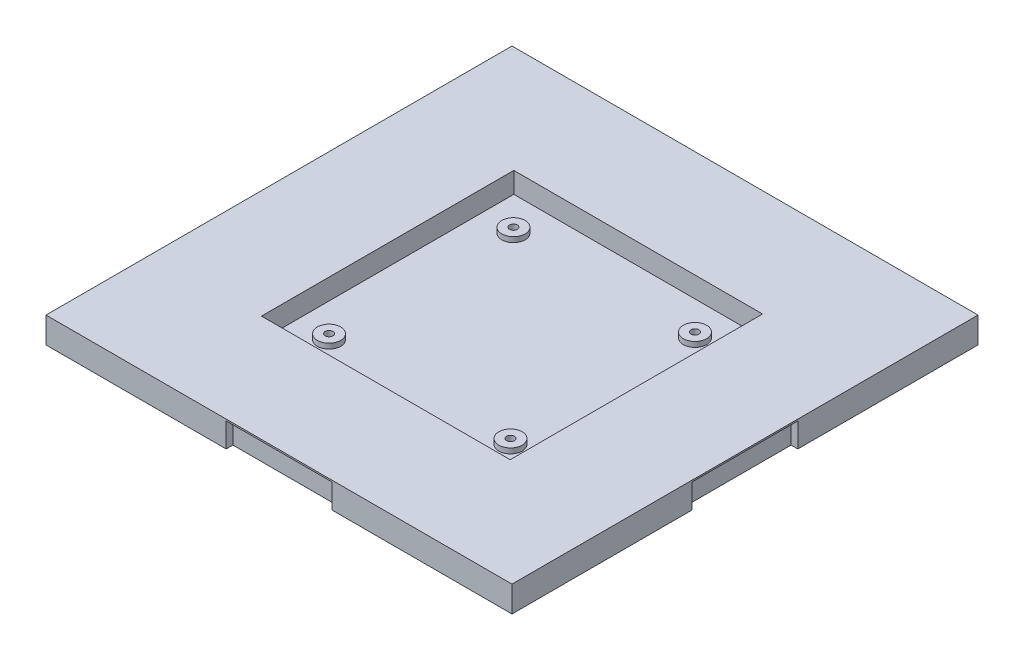
ISO-10303-21;
HEADER;
FILE_DESCRIPTION(('STEP AP214'),'2;1');
FILE_NAME('part.step','',(''),(''),'','','');
FILE_SCHEMA(('AUTOMOTIVE_DESIGN { 1 0 10303 214 1 1 1 1 }'));
ENDSEC;
DATA;
#1=APPLICATION_CONTEXT('core data for automotive mechanical design processes');
#2=APPLICATION_PROTOCOL_DEFINITION('international standard','automotive_design',2000,#1);
#3=PRODUCT_CONTEXT('',#1,'mechanical');
#4=PRODUCT('Part','Part','',(#3));
#5=PRODUCT_RELATED_PRODUCT_CATEGORY('part','',(#4));
#6=PRODUCT_DEFINITION_FORMATION('','',#4);
#7=PRODUCT_DEFINITION_CONTEXT('part definition',#1,'design');
#8=PRODUCT_DEFINITION('design','',#6,#7);
#9=PRODUCT_DEFINITION_SHAPE('','',#8);
#10=(LENGTH_UNIT() NAMED_UNIT(*) SI_UNIT(.MILLI.,.METRE.));
#11=(NAMED_UNIT(*) PLANE_ANGLE_UNIT() SI_UNIT($,.RADIAN.));
#12=(NAMED_UNIT(*) SI_UNIT($,.STERADIAN.) SOLID_ANGLE_UNIT());
#13=UNCERTAINTY_MEASURE_WITH_UNIT(LENGTH_MEASURE(1.E-05),#10,'distance_accuracy_value','');
#14=(GEOMETRIC_REPRESENTATION_CONTEXT(3) GLOBAL_UNCERTAINTY_ASSIGNED_CONTEXT((#13)) GLOBAL_UNIT_ASSIGNED_CONTEXT((#10,
#11,#12)) REPRESENTATION_CONTEXT('',''));
#15=CARTESIAN_POINT('',(0.,0.,0.));
#16=DIRECTION('',(0.,0.,1.));
#17=DIRECTION('',(1.,0.,0.));
#18=AXIS2_PLACEMENT_3D('',#15,#16,#17);
#19=CARTESIAN_POINT('',(0.,10.,48.73501539));
#20=DIRECTION('',(0.,0.,1.));
#21=DIRECTION('',(1.,0.,0.));
#22=AXIS2_PLACEMENT_3D('',#19,#20,#21);
#23=PLANE('',#22);
#24=DIRECTION('',(0.,-1.,0.));
#25=VECTOR('',#24,1.);
#26=CARTESIAN_POINT('',(48.0365109443665,10.,48.73501539));
#27=LINE('',#26,#25);
#28=CARTESIAN_POINT('',(48.0365109443665,10.,48.73501539));
#29=VERTEX_POINT('',#28);
#30=CARTESIAN_POINT('',(48.0365109443665,2.,48.73501539));
#31=VERTEX_POINT('',#30);
#32=EDGE_CURVE('E476',#29,#31,#27,.T.);
#33=ORIENTED_EDGE('',*,*,#32,.T.);
#34=DIRECTION('',(-1.,0.,0.));
#35=VECTOR('',#34,1.);
#36=CARTESIAN_POINT('',(0.,2.,48.73501539));
#37=LINE('',#36,#35);
#38=CARTESIAN_POINT('',(-48.0365109443665,2.,48.73501539));
#39=VERTEX_POINT('',#38);
#40=EDGE_CURVE('E417',#31,#39,#37,.T.);
#41=ORIENTED_EDGE('',*,*,#40,.T.);
#42=DIRECTION('',(0.,-1.,0.));
#43=VECTOR('',#42,1.);
#44=CARTESIAN_POINT('',(-48.0365109443665,10.,48.73501539));
#45=LINE('',#44,#43);
#46=CARTESIAN_POINT('',(-48.0365109443665,10.,48.73501539));
#47=VERTEX_POINT('',#46);
#48=EDGE_CURVE('E489',#47,#39,#45,.T.);
#49=ORIENTED_EDGE('',*,*,#48,.F.);
#50=DIRECTION('',(-1.,0.,0.));
#51=VECTOR('',#50,1.);
#52=CARTESIAN_POINT('',(0.,10.,48.73501539));
#53=LINE('',#52,#51);
#54=EDGE_CURVE('E445',#29,#47,#53,.T.);
#55=ORIENTED_EDGE('',*,*,#54,.F.);
#56=EDGE_LOOP('',(#33,#41,#49,#55));
#57=FACE_BOUND('',#56,.T.);
#58=ADVANCED_FACE('F40',(#57),#23,.F.);
#59=CARTESIAN_POINT('',(-48.0365109443665,10.,0.));
#60=DIRECTION('',(-1.,0.,0.));
#61=DIRECTION('',(0.,0.,1.));
#62=AXIS2_PLACEMENT_3D('',#59,#60,#61);
#63=PLANE('',#62);
#64=ORIENTED_EDGE('',*,*,#48,.T.);
#65=DIRECTION('',(0.,0.,-1.));
#66=VECTOR('',#65,1.);
#67=CARTESIAN_POINT('',(-48.0365109443665,2.,0.));
#68=LINE('',#67,#66);
#69=CARTESIAN_POINT('',(-48.0365109443665,2.,-48.73501539));
#70=VERTEX_POINT('',#69);
#71=EDGE_CURVE('E413',#39,#70,#68,.T.);
#72=ORIENTED_EDGE('',*,*,#71,.T.);
#73=DIRECTION('',(0.,-1.,0.));
#74=VECTOR('',#73,1.);
#75=CARTESIAN_POINT('',(-48.0365109443665,10.,-48.73501539));
#76=LINE('',#75,#74);
#77=CARTESIAN_POINT('',(-48.0365109443665,10.,-48.73501539));
#78=VERTEX_POINT('',#77);
#79=EDGE_CURVE('E485',#78,#70,#76,.T.);
#80=ORIENTED_EDGE('',*,*,#79,.F.);
#81=DIRECTION('',(0.,0.,-1.));
#82=VECTOR('',#81,1.);
#83=CARTESIAN_POINT('',(-48.0365109443665,10.,0.));
#84=LINE('',#83,#82);
#85=EDGE_CURVE('E449',#47,#78,#84,.T.);
#86=ORIENTED_EDGE('',*,*,#85,.F.);
#87=EDGE_LOOP('',(#64,#72,#80,#86));
#88=FACE_BOUND('',#87,.T.);
#89=ADVANCED_FACE('F586',(#88),#63,.F.);
#90=CARTESIAN_POINT('',(0.,10.,-48.73501539));
#91=DIRECTION('',(0.,0.,-1.));
#92=DIRECTION('',(-1.,0.,0.));
#93=AXIS2_PLACEMENT_3D('',#90,#91,#92);
#94=PLANE('',#93);
#95=ORIENTED_EDGE('',*,*,#79,.T.);
#96=DIRECTION('',(1.,0.,0.));
#97=VECTOR('',#96,1.);
#98=CARTESIAN_POINT('',(0.,2.,-48.73501539));
#99=LINE('',#98,#97);
#100=CARTESIAN_POINT('',(48.0365109443665,2.,-48.73501539));
#101=VERTEX_POINT('',#100);
#102=EDGE_CURVE('E425',#70,#101,#99,.T.);
#103=ORIENTED_EDGE('',*,*,#102,.T.);
#104=DIRECTION('',(0.,-1.,0.));
#105=VECTOR('',#104,1.);
#106=CARTESIAN_POINT('',(48.0365109443665,10.,-48.73501539));
#107=LINE('',#106,#105);
#108=CARTESIAN_POINT('',(48.0365109443665,10.,-48.73501539));
#109=VERTEX_POINT('',#108);
#110=EDGE_CURVE('E480',#109,#101,#107,.T.);
#111=ORIENTED_EDGE('',*,*,#110,.F.);
#112=DIRECTION('',(1.,0.,0.));
#113=VECTOR('',#112,1.);
#114=CARTESIAN_POINT('',(0.,10.,-48.73501539));
#115=LINE('',#114,#113);
#116=EDGE_CURVE('E452',#78,#109,#115,.T.);
#117=ORIENTED_EDGE('',*,*,#116,.F.);
#118=EDGE_LOOP('',(#95,#103,#111,#117));
#119=FACE_BOUND('',#118,.T.);
#120=ADVANCED_FACE('F592',(#119),#94,.F.);
#121=CARTESIAN_POINT('',(90.,10.,0.));
#122=DIRECTION('',(1.,0.,0.));
#123=DIRECTION('',(0.,0.,-1.));
#124=AXIS2_PLACEMENT_3D('',#121,#122,#123);
#125=PLANE('',#124);
#126=DIRECTION('',(0.,-1.,0.));
#127=VECTOR('',#126,1.);
#128=CARTESIAN_POINT('',(90.,10.,20.40004931462));
#129=LINE('',#128,#127);
#130=CARTESIAN_POINT('',(90.,9.40000000000001,20.40004931462));
#131=VERTEX_POINT('',#130);
#132=CARTESIAN_POINT('',(90.,0.,20.40004931462));
#133=VERTEX_POINT('',#132);
#134=EDGE_CURVE('E294',#131,#133,#129,.T.);
#135=ORIENTED_EDGE('',*,*,#134,.F.);
#136=DIRECTION('',(0.,0.,-1.));
#137=VECTOR('',#136,1.);
#138=CARTESIAN_POINT('',(90.,9.40000000000001,0.));
#139=LINE('',#138,#137);
#140=CARTESIAN_POINT('',(90.,9.40000000000001,-20.39995068538));
#141=VERTEX_POINT('',#140);
#142=EDGE_CURVE('E11',#131,#141,#139,.T.);
#143=ORIENTED_EDGE('',*,*,#142,.T.);
#144=DIRECTION('',(0.,-1.,0.));
#145=VECTOR('',#144,1.);
#146=CARTESIAN_POINT('',(90.,10.,-20.39995068538));
#147=LINE('',#146,#145);
#148=CARTESIAN_POINT('',(90.,0.,-20.39995068538));
#149=VERTEX_POINT('',#148);
#150=EDGE_CURVE('E290',#141,#149,#147,.T.);
#151=ORIENTED_EDGE('',*,*,#150,.T.);
#152=DIRECTION('',(0.,0.,1.));
#153=VECTOR('',#152,1.);
#154=CARTESIAN_POINT('',(90.,0.,0.));
#155=LINE('',#154,#153);
#156=CARTESIAN_POINT('',(90.,0.,-90.));
#157=VERTEX_POINT('',#156);
#158=EDGE_CURVE('E459',#157,#149,#155,.T.);
#159=ORIENTED_EDGE('',*,*,#158,.F.);
#160=DIRECTION('',(0.,-1.,0.));
#161=VECTOR('',#160,1.);
#162=CARTESIAN_POINT('',(90.,10.,-90.));
#163=LINE('',#162,#161);
#164=CARTESIAN_POINT('',(90.,10.,-90.));
#165=VERTEX_POINT('',#164);
#166=EDGE_CURVE('E481',#165,#157,#163,.T.);
#167=ORIENTED_EDGE('',*,*,#166,.F.);
#168=DIRECTION('',(0.,0.,1.));
#169=VECTOR('',#168,1.);
#170=CARTESIAN_POINT('',(90.,10.,0.));
#171=LINE('',#170,#169);
#172=CARTESIAN_POINT('',(90.,10.,90.));
#173=VERTEX_POINT('',#172);
#174=EDGE_CURVE('E430',#165,#173,#171,.T.);
#175=ORIENTED_EDGE('',*,*,#174,.T.);
#176=DIRECTION('',(0.,-1.,0.));
#177=VECTOR('',#176,1.);
#178=CARTESIAN_POINT('',(90.,10.,90.));
#179=LINE('',#178,#177);
#180=CARTESIAN_POINT('',(90.,0.,90.));
#181=VERTEX_POINT('',#180);
#182=EDGE_CURVE('E458',#173,#181,#179,.T.);
#183=ORIENTED_EDGE('',*,*,#182,.T.);
#184=EDGE_CURVE('E429',#133,#181,#155,.T.);
#185=ORIENTED_EDGE('',*,*,#184,.F.);
#186=EDGE_LOOP('',(#135,#143,#151,#159,#167,#175,#183,#185));
#187=FACE_BOUND('',#186,.T.);
#188=ADVANCED_FACE('F42',(#187),#125,.T.);
#189=CARTESIAN_POINT('',(0.,10.,-90.));
#190=DIRECTION('',(0.,0.,-1.));
#191=DIRECTION('',(-1.,0.,0.));
#192=AXIS2_PLACEMENT_3D('',#189,#190,#191);
#193=PLANE('',#192);
#194=DIRECTION('',(0.,-1.,0.));
#195=VECTOR('',#194,1.);
#196=CARTESIAN_POINT('',(20.4,0.,-90.));
#197=LINE('',#196,#195);
#198=CARTESIAN_POINT('',(20.4,9.40000000000001,-90.));
#199=VERTEX_POINT('',#198);
#200=CARTESIAN_POINT('',(20.4,0.,-90.));
#201=VERTEX_POINT('',#200);
#202=EDGE_CURVE('E318',#199,#201,#197,.T.);
#203=ORIENTED_EDGE('',*,*,#202,.F.);
#204=DIRECTION('',(-1.,0.,0.));
#205=VECTOR('',#204,1.);
#206=CARTESIAN_POINT('',(0.,9.40000000000001,-90.));
#207=LINE('',#206,#205);
#208=CARTESIAN_POINT('',(-20.4,9.40000000000001,-90.));
#209=VERTEX_POINT('',#208);
#210=EDGE_CURVE('E331',#199,#209,#207,.T.);
#211=ORIENTED_EDGE('',*,*,#210,.T.);
#212=DIRECTION('',(0.,-1.,0.));
#213=VECTOR('',#212,1.);
#214=CARTESIAN_POINT('',(-20.4,0.,-90.));
#215=LINE('',#214,#213);
#216=CARTESIAN_POINT('',(-20.4,0.,-90.));
#217=VERTEX_POINT('',#216);
#218=EDGE_CURVE('E312',#209,#217,#215,.T.);
#219=ORIENTED_EDGE('',*,*,#218,.T.);
#220=DIRECTION('',(1.,0.,0.));
#221=VECTOR('',#220,1.);
#222=CARTESIAN_POINT('',(0.,0.,-90.));
#223=LINE('',#222,#221);
#224=CARTESIAN_POINT('',(-90.,0.,-90.));
#225=VERTEX_POINT('',#224);
#226=EDGE_CURVE('E464',#225,#217,#223,.T.);
#227=ORIENTED_EDGE('',*,*,#226,.F.);
#228=DIRECTION('',(0.,-1.,0.));
#229=VECTOR('',#228,1.);
#230=CARTESIAN_POINT('',(-90.,10.,-90.));
#231=LINE('',#230,#229);
#232=CARTESIAN_POINT('',(-90.,10.,-90.));
#233=VERTEX_POINT('',#232);
#234=EDGE_CURVE('E501',#233,#225,#231,.T.);
#235=ORIENTED_EDGE('',*,*,#234,.F.);
#236=DIRECTION('',(1.,0.,0.));
#237=VECTOR('',#236,1.);
#238=CARTESIAN_POINT('',(0.,10.,-90.));
#239=LINE('',#238,#237);
#240=EDGE_CURVE('E434',#233,#165,#239,.T.);
#241=ORIENTED_EDGE('',*,*,#240,.T.);
#242=ORIENTED_EDGE('',*,*,#166,.T.);
#243=EDGE_CURVE('E463',#201,#157,#223,.T.);
#244=ORIENTED_EDGE('',*,*,#243,.F.);
#245=EDGE_LOOP('',(#203,#211,#219,#227,#235,#241,#242,#244));
#246=FACE_BOUND('',#245,.T.);
#247=ADVANCED_FACE('F524',(#246),#193,.T.);
#248=CARTESIAN_POINT('',(-90.,10.,0.));
#249=DIRECTION('',(1.,0.,0.));
#250=DIRECTION('',(0.,0.,-1.));
#251=AXIS2_PLACEMENT_3D('',#248,#249,#250);
#252=PLANE('',#251);
#253=DIRECTION('',(0.,0.,1.));
#254=VECTOR('',#253,1.);
#255=CARTESIAN_POINT('',(-90.,0.,0.));
#256=LINE('',#255,#254);
#257=CARTESIAN_POINT('',(-90.,0.,-20.3964704723527));
#258=VERTEX_POINT('',#257);
#259=EDGE_CURVE('E468',#225,#258,#256,.T.);
#260=ORIENTED_EDGE('',*,*,#259,.T.);
#261=DIRECTION('',(0.,1.,0.));
#262=VECTOR('',#261,1.);
#263=CARTESIAN_POINT('',(-90.,10.,-20.3964704723527));
#264=LINE('',#263,#262);
#265=CARTESIAN_POINT('',(-90.,9.40000000000001,-20.3964704723527));
#266=VERTEX_POINT('',#265);
#267=EDGE_CURVE('E308',#258,#266,#264,.T.);
#268=ORIENTED_EDGE('',*,*,#267,.T.);
#269=DIRECTION('',(0.,0.,-1.));
#270=VECTOR('',#269,1.);
#271=CARTESIAN_POINT('',(-90.,9.40000000000001,0.));
#272=LINE('',#271,#270);
#273=CARTESIAN_POINT('',(-90.,9.40000000000001,20.4035295276473));
#274=VERTEX_POINT('',#273);
#275=EDGE_CURVE('E49',#274,#266,#272,.T.);
#276=ORIENTED_EDGE('',*,*,#275,.F.);
#277=DIRECTION('',(0.,1.,0.));
#278=VECTOR('',#277,1.);
#279=CARTESIAN_POINT('',(-90.,10.,20.4035295276473));
#280=LINE('',#279,#278);
#281=CARTESIAN_POINT('',(-90.,0.,20.4035295276473));
#282=VERTEX_POINT('',#281);
#283=EDGE_CURVE('E305',#282,#274,#280,.T.);
#284=ORIENTED_EDGE('',*,*,#283,.F.);
#285=CARTESIAN_POINT('',(-90.,0.,90.));
#286=VERTEX_POINT('',#285);
#287=EDGE_CURVE('E227',#282,#286,#256,.T.);
#288=ORIENTED_EDGE('',*,*,#287,.T.);
#289=DIRECTION('',(0.,-1.,0.));
#290=VECTOR('',#289,1.);
#291=CARTESIAN_POINT('',(-90.,10.,90.));
#292=LINE('',#291,#290);
#293=CARTESIAN_POINT('',(-90.,10.,90.));
#294=VERTEX_POINT('',#293);
#295=EDGE_CURVE('E497',#294,#286,#292,.T.);
#296=ORIENTED_EDGE('',*,*,#295,.F.);
#297=DIRECTION('',(0.,0.,1.));
#298=VECTOR('',#297,1.);
#299=CARTESIAN_POINT('',(-90.,10.,0.));
#300=LINE('',#299,#298);
#301=EDGE_CURVE('E439',#233,#294,#300,.T.);
#302=ORIENTED_EDGE('',*,*,#301,.F.);
#303=ORIENTED_EDGE('',*,*,#234,.T.);
#304=EDGE_LOOP('',(#260,#268,#276,#284,#288,#296,#302,#303));
#305=FACE_BOUND('',#304,.T.);
#306=ADVANCED_FACE('F517',(#305),#252,.F.);
#307=CARTESIAN_POINT('',(0.,10.,90.));
#308=DIRECTION('',(0.,0.,-1.));
#309=DIRECTION('',(-1.,0.,0.));
#310=AXIS2_PLACEMENT_3D('',#307,#308,#309);
#311=PLANE('',#310);
#312=DIRECTION('',(1.,0.,0.));
#313=VECTOR('',#312,1.);
#314=CARTESIAN_POINT('',(0.,0.,90.));
#315=LINE('',#314,#313);
#316=CARTESIAN_POINT('',(-20.3965197869739,0.,90.));
#317=VERTEX_POINT('',#316);
#318=EDGE_CURVE('E435',#286,#317,#315,.T.);
#319=ORIENTED_EDGE('',*,*,#318,.T.);
#320=DIRECTION('',(0.,1.,0.));
#321=VECTOR('',#320,1.);
#322=CARTESIAN_POINT('',(-20.3965197869739,10.,90.));
#323=LINE('',#322,#321);
#324=CARTESIAN_POINT('',(-20.3965197869739,9.40000000000001,90.));
#325=VERTEX_POINT('',#324);
#326=EDGE_CURVE('E301',#317,#325,#323,.T.);
#327=ORIENTED_EDGE('',*,*,#326,.T.);
#328=DIRECTION('',(-1.,0.,0.));
#329=VECTOR('',#328,1.);
#330=CARTESIAN_POINT('',(0.,9.40000000000001,90.));
#331=LINE('',#330,#329);
#332=CARTESIAN_POINT('',(20.4034802130261,9.40000000000001,90.));
#333=VERTEX_POINT('',#332);
#334=EDGE_CURVE('E493',#333,#325,#331,.T.);
#335=ORIENTED_EDGE('',*,*,#334,.F.);
#336=DIRECTION('',(0.,1.,0.));
#337=VECTOR('',#336,1.);
#338=CARTESIAN_POINT('',(20.4034802130261,10.,90.));
#339=LINE('',#338,#337);
#340=CARTESIAN_POINT('',(20.4034802130261,0.,90.));
#341=VERTEX_POINT('',#340);
#342=EDGE_CURVE('E298',#341,#333,#339,.T.);
#343=ORIENTED_EDGE('',*,*,#342,.F.);
#344=EDGE_CURVE('E472',#341,#181,#315,.T.);
#345=ORIENTED_EDGE('',*,*,#344,.T.);
#346=ORIENTED_EDGE('',*,*,#182,.F.);
#347=DIRECTION('',(1.,0.,0.));
#348=VECTOR('',#347,1.);
#349=CARTESIAN_POINT('',(0.,10.,90.));
#350=LINE('',#349,#348);
#351=EDGE_CURVE('E442',#294,#173,#350,.T.);
#352=ORIENTED_EDGE('',*,*,#351,.F.);
#353=ORIENTED_EDGE('',*,*,#295,.T.);
#354=EDGE_LOOP('',(#319,#327,#335,#343,#345,#346,#352,#353));
#355=FACE_BOUND('',#354,.T.);
#356=ADVANCED_FACE('F560',(#355),#311,.F.);
#357=CARTESIAN_POINT('',(48.0365109443665,10.,0.));
#358=DIRECTION('',(1.,0.,0.));
#359=DIRECTION('',(0.,0.,-1.));
#360=AXIS2_PLACEMENT_3D('',#357,#358,#359);
#361=PLANE('',#360);
#362=ORIENTED_EDGE('',*,*,#110,.T.);
#363=DIRECTION('',(0.,0.,1.));
#364=VECTOR('',#363,1.);
#365=CARTESIAN_POINT('',(48.0365109443665,2.,0.));
#366=LINE('',#365,#364);
#367=EDGE_CURVE('E421',#101,#31,#366,.T.);
#368=ORIENTED_EDGE('',*,*,#367,.T.);
#369=ORIENTED_EDGE('',*,*,#32,.F.);
#370=DIRECTION('',(0.,0.,1.));
#371=VECTOR('',#370,1.);
#372=CARTESIAN_POINT('',(48.0365109443665,10.,0.));
#373=LINE('',#372,#371);
#374=EDGE_CURVE('E455',#109,#29,#373,.T.);
#375=ORIENTED_EDGE('',*,*,#374,.F.);
#376=EDGE_LOOP('',(#362,#368,#369,#375));
#377=FACE_BOUND('',#376,.T.);
#378=ADVANCED_FACE('F599',(#377),#361,.F.);
#379=CARTESIAN_POINT('',(0.,10.,0.));
#380=DIRECTION('',(0.,1.,0.));
#381=DIRECTION('',(0.,0.,1.));
#382=AXIS2_PLACEMENT_3D('',#379,#380,#381);
#383=PLANE('',#382);
#384=ORIENTED_EDGE('',*,*,#174,.F.);
#385=ORIENTED_EDGE('',*,*,#240,.F.);
#386=ORIENTED_EDGE('',*,*,#301,.T.);
#387=ORIENTED_EDGE('',*,*,#351,.T.);
#388=EDGE_LOOP('',(#384,#385,#386,#387));
#389=FACE_BOUND('',#388,.T.);
#390=ORIENTED_EDGE('',*,*,#54,.T.);
#391=ORIENTED_EDGE('',*,*,#85,.T.);
#392=ORIENTED_EDGE('',*,*,#116,.T.);
#393=ORIENTED_EDGE('',*,*,#374,.T.);
#394=EDGE_LOOP('',(#390,#391,#392,#393));
#395=FACE_BOUND('',#394,.T.);
#396=ADVANCED_FACE('F617',(#389,#395),#383,.T.);
#397=CARTESIAN_POINT('',(0.,0.,0.));
#398=DIRECTION('',(0.,1.,0.));
#399=DIRECTION('',(0.,0.,1.));
#400=AXIS2_PLACEMENT_3D('',#397,#398,#399);
#401=PLANE('',#400);
#402=DIRECTION('',(0.,0.,1.));
#403=VECTOR('',#402,1.);
#404=CARTESIAN_POINT('',(-87.4000493146209,0.,0.00352952764729333));
#405=LINE('',#404,#403);
#406=CARTESIAN_POINT('',(-87.400049314621,0.,-20.3964704723527));
#407=VERTEX_POINT('',#406);
#408=CARTESIAN_POINT('',(-87.4000493146208,0.,20.4035295276473));
#409=VERTEX_POINT('',#408);
#410=EDGE_CURVE('E215',#407,#409,#405,.T.);
#411=ORIENTED_EDGE('',*,*,#410,.F.);
#412=DIRECTION('',(-1.,0.,0.));
#413=VECTOR('',#412,1.);
#414=CARTESIAN_POINT('',(-87.400049314621,0.,-20.3964704723527));
#415=LINE('',#414,#413);
#416=EDGE_CURVE('E295',#407,#258,#415,.T.);
#417=ORIENTED_EDGE('',*,*,#416,.T.);
#418=ORIENTED_EDGE('',*,*,#259,.F.);
#419=ORIENTED_EDGE('',*,*,#226,.T.);
#420=DIRECTION('',(0.,0.,-1.));
#421=VECTOR('',#420,1.);
#422=CARTESIAN_POINT('',(-20.4,0.,-87.4));
#423=LINE('',#422,#421);
#424=CARTESIAN_POINT('',(-20.4,0.,-87.4));
#425=VERTEX_POINT('',#424);
#426=EDGE_CURVE('E327',#425,#217,#423,.T.);
#427=ORIENTED_EDGE('',*,*,#426,.F.);
#428=DIRECTION('',(-1.,0.,0.));
#429=VECTOR('',#428,1.);
#430=CARTESIAN_POINT('',(0.,0.,-87.4));
#431=LINE('',#430,#429);
#432=CARTESIAN_POINT('',(20.4,0.,-87.4));
#433=VERTEX_POINT('',#432);
#434=EDGE_CURVE('E313',#433,#425,#431,.T.);
#435=ORIENTED_EDGE('',*,*,#434,.F.);
#436=DIRECTION('',(0.,0.,-1.));
#437=VECTOR('',#436,1.);
#438=CARTESIAN_POINT('',(20.4,0.,-87.4));
#439=LINE('',#438,#437);
#440=EDGE_CURVE('E337',#433,#201,#439,.T.);
#441=ORIENTED_EDGE('',*,*,#440,.T.);
#442=ORIENTED_EDGE('',*,*,#243,.T.);
#443=ORIENTED_EDGE('',*,*,#158,.T.);
#444=DIRECTION('',(1.,0.,0.));
#445=VECTOR('',#444,1.);
#446=CARTESIAN_POINT('',(87.4035295276468,0.,-20.39995068538));
#447=LINE('',#446,#445);
#448=CARTESIAN_POINT('',(87.4035295276468,0.,-20.39995068538));
#449=VERTEX_POINT('',#448);
#450=EDGE_CURVE('E276',#449,#149,#447,.T.);
#451=ORIENTED_EDGE('',*,*,#450,.F.);
#452=DIRECTION('',(0.,0.,-1.));
#453=VECTOR('',#452,1.);
#454=CARTESIAN_POINT('',(87.403529527647,0.,4.93146199897005E-05));
#455=LINE('',#454,#453);
#456=CARTESIAN_POINT('',(87.4035295276472,0.,20.40004931462));
#457=VERTEX_POINT('',#456);
#458=EDGE_CURVE('E263',#457,#449,#455,.T.);
#459=ORIENTED_EDGE('',*,*,#458,.F.);
#460=DIRECTION('',(1.,0.,0.));
#461=VECTOR('',#460,1.);
#462=CARTESIAN_POINT('',(87.4035295276472,0.,20.40004931462));
#463=LINE('',#462,#461);
#464=EDGE_CURVE('E241',#457,#133,#463,.T.);
#465=ORIENTED_EDGE('',*,*,#464,.T.);
#466=ORIENTED_EDGE('',*,*,#184,.T.);
#467=ORIENTED_EDGE('',*,*,#344,.F.);
#468=DIRECTION('',(0.,0.,1.));
#469=VECTOR('',#468,1.);
#470=CARTESIAN_POINT('',(20.4034802130261,0.,87.4035788422679));
#471=LINE('',#470,#469);
#472=CARTESIAN_POINT('',(20.4034802130261,0.,87.4035788422679));
#473=VERTEX_POINT('',#472);
#474=EDGE_CURVE('E249',#473,#341,#471,.T.);
#475=ORIENTED_EDGE('',*,*,#474,.F.);
#476=DIRECTION('',(1.,0.,0.));
#477=VECTOR('',#476,1.);
#478=CARTESIAN_POINT('',(0.00348021302608298,0.,87.4035788422679));
#479=LINE('',#478,#477);
#480=CARTESIAN_POINT('',(-20.3965197869739,0.,87.4035788422679));
#481=VERTEX_POINT('',#480);
#482=EDGE_CURVE('E237',#481,#473,#479,.T.);
#483=ORIENTED_EDGE('',*,*,#482,.F.);
#484=DIRECTION('',(0.,0.,1.));
#485=VECTOR('',#484,1.);
#486=CARTESIAN_POINT('',(-20.3965197869739,0.,87.4035788422679));
#487=LINE('',#486,#485);
#488=EDGE_CURVE('E222',#481,#317,#487,.T.);
#489=ORIENTED_EDGE('',*,*,#488,.T.);
#490=ORIENTED_EDGE('',*,*,#318,.F.);
#491=ORIENTED_EDGE('',*,*,#287,.F.);
#492=DIRECTION('',(-1.,0.,0.));
#493=VECTOR('',#492,1.);
#494=CARTESIAN_POINT('',(-87.4000493146208,0.,20.4035295276473));
#495=LINE('',#494,#493);
#496=EDGE_CURVE('E209',#409,#282,#495,.T.);
#497=ORIENTED_EDGE('',*,*,#496,.F.);
#498=EDGE_LOOP('',(#411,#417,#418,#419,#427,#435,#441,#442,#443,#451,#459,#465,#466,#467,#475,
#483,#489,#490,#491,#497));
#499=FACE_BOUND('',#498,.T.);
#500=ADVANCED_FACE('F225',(#499),#401,.F.);
#501=CARTESIAN_POINT('',(0.,2.,0.));
#502=DIRECTION('',(0.,1.,0.));
#503=DIRECTION('',(0.,0.,1.));
#504=AXIS2_PLACEMENT_3D('',#501,#502,#503);
#505=PLANE('',#504);
#506=CARTESIAN_POINT('',(-35.1155055733189,2.,35.5588809921067));
#507=DIRECTION('',(0.,1.,0.));
#508=DIRECTION('',(0.,0.,1.));
#509=AXIS2_PLACEMENT_3D('',#506,#507,#508);
#510=CIRCLE('',#509,4.5);
#511=CARTESIAN_POINT('',(-35.1155055733189,2.,40.0588809921067));
#512=VERTEX_POINT('',#511);
#513=EDGE_CURVE('E397',#512,#512,#510,.T.);
#514=ORIENTED_EDGE('',*,*,#513,.F.);
#515=EDGE_LOOP('',(#514));
#516=FACE_BOUND('',#515,.T.);
#517=CARTESIAN_POINT('',(34.9909169418538,2.,35.5588809921067));
#518=DIRECTION('',(0.,1.,0.));
#519=DIRECTION('',(0.,0.,1.));
#520=AXIS2_PLACEMENT_3D('',#517,#518,#519);
#521=CIRCLE('',#520,4.5);
#522=CARTESIAN_POINT('',(34.9909169418538,2.,40.0588809921067));
#523=VERTEX_POINT('',#522);
#524=EDGE_CURVE('E401',#523,#523,#521,.T.);
#525=ORIENTED_EDGE('',*,*,#524,.F.);
#526=EDGE_LOOP('',(#525));
#527=FACE_BOUND('',#526,.T.);
#528=CARTESIAN_POINT('',(34.9909169418538,2.,-35.6870004655541));
#529=DIRECTION('',(0.,1.,0.));
#530=DIRECTION('',(0.,0.,1.));
#531=AXIS2_PLACEMENT_3D('',#528,#529,#530);
#532=CIRCLE('',#531,4.5);
#533=CARTESIAN_POINT('',(34.9909169418538,2.,-31.1870004655541));
#534=VERTEX_POINT('',#533);
#535=EDGE_CURVE('E405',#534,#534,#532,.T.);
#536=ORIENTED_EDGE('',*,*,#535,.F.);
#537=EDGE_LOOP('',(#536));
#538=FACE_BOUND('',#537,.T.);
#539=CARTESIAN_POINT('',(-35.1155055733189,2.,-35.6870004655541));
#540=DIRECTION('',(0.,1.,0.));
#541=DIRECTION('',(0.,0.,1.));
#542=AXIS2_PLACEMENT_3D('',#539,#540,#541);
#543=CIRCLE('',#542,4.5);
#544=CARTESIAN_POINT('',(-35.1155055733189,2.,-31.1870004655541));
#545=VERTEX_POINT('',#544);
#546=EDGE_CURVE('E409',#545,#545,#543,.T.);
#547=ORIENTED_EDGE('',*,*,#546,.F.);
#548=EDGE_LOOP('',(#547));
#549=FACE_BOUND('',#548,.T.);
#550=ORIENTED_EDGE('',*,*,#71,.F.);
#551=ORIENTED_EDGE('',*,*,#40,.F.);
#552=ORIENTED_EDGE('',*,*,#367,.F.);
#553=ORIENTED_EDGE('',*,*,#102,.F.);
#554=EDGE_LOOP('',(#550,#551,#552,#553));
#555=FACE_BOUND('',#554,.T.);
#556=ADVANCED_FACE('F621',(#516,#527,#538,#549,#555),#505,.T.);
#557=CARTESIAN_POINT('',(0.,4.,0.));
#558=DIRECTION('',(0.,1.,0.));
#559=DIRECTION('',(0.,0.,1.));
#560=AXIS2_PLACEMENT_3D('',#557,#558,#559);
#561=PLANE('',#560);
#562=CARTESIAN_POINT('',(-35.1155055733189,4.,35.5588809921067));
#563=DIRECTION('',(0.,1.,0.));
#564=DIRECTION('',(0.,0.,1.));
#565=AXIS2_PLACEMENT_3D('',#562,#563,#564);
#566=CIRCLE('',#565,1.5);
#567=CARTESIAN_POINT('',(-35.1155055733189,4.,37.0588809921067));
#568=VERTEX_POINT('',#567);
#569=EDGE_CURVE('E341',#568,#568,#566,.T.);
#570=ORIENTED_EDGE('',*,*,#569,.F.);
#571=EDGE_LOOP('',(#570));
#572=FACE_BOUND('',#571,.T.);
#573=CARTESIAN_POINT('',(-35.1155055733189,4.,35.5588809921067));
#574=DIRECTION('',(0.,1.,0.));
#575=DIRECTION('',(0.,0.,1.));
#576=AXIS2_PLACEMENT_3D('',#573,#574,#575);
#577=CIRCLE('',#576,4.5);
#578=CARTESIAN_POINT('',(-35.1155055733189,4.,40.0588809921067));
#579=VERTEX_POINT('',#578);
#580=EDGE_CURVE('E393',#579,#579,#577,.T.);
#581=ORIENTED_EDGE('',*,*,#580,.T.);
#582=EDGE_LOOP('',(#581));
#583=FACE_BOUND('',#582,.T.);
#584=ADVANCED_FACE('F627',(#572,#583),#561,.T.);
#585=CARTESIAN_POINT('',(-35.1155055733189,4.,35.5588809921067));
#586=DIRECTION('',(0.,-1.,0.));
#587=DIRECTION('',(0.,0.,-1.));
#588=AXIS2_PLACEMENT_3D('',#585,#586,#587);
#589=CYLINDRICAL_SURFACE('',#588,4.5);
#590=ORIENTED_EDGE('',*,*,#513,.T.);
#591=EDGE_LOOP('',(#590));
#592=FACE_BOUND('',#591,.T.);
#593=ORIENTED_EDGE('',*,*,#580,.F.);
#594=EDGE_LOOP('',(#593));
#595=FACE_BOUND('',#594,.T.);
#596=ADVANCED_FACE('F629',(#592,#595),#589,.T.);
#597=CARTESIAN_POINT('',(0.,4.,0.));
#598=DIRECTION('',(0.,1.,0.));
#599=DIRECTION('',(0.,0.,1.));
#600=AXIS2_PLACEMENT_3D('',#597,#598,#599);
#601=PLANE('',#600);
#602=CARTESIAN_POINT('',(34.9909169418538,4.,35.5588809921067));
#603=DIRECTION('',(0.,1.,0.));
#604=DIRECTION('',(0.,0.,1.));
#605=AXIS2_PLACEMENT_3D('',#602,#603,#604);
#606=CIRCLE('',#605,1.5);
#607=CARTESIAN_POINT('',(34.9909169418538,4.,37.0588809921067));
#608=VERTEX_POINT('',#607);
#609=EDGE_CURVE('E363',#608,#608,#606,.T.);
#610=ORIENTED_EDGE('',*,*,#609,.F.);
#611=EDGE_LOOP('',(#610));
#612=FACE_BOUND('',#611,.T.);
#613=CARTESIAN_POINT('',(34.9909169418538,4.,35.5588809921067));
#614=DIRECTION('',(0.,1.,0.));
#615=DIRECTION('',(0.,0.,1.));
#616=AXIS2_PLACEMENT_3D('',#613,#614,#615);
#617=CIRCLE('',#616,4.5);
#618=CARTESIAN_POINT('',(34.9909169418538,4.,40.0588809921067));
#619=VERTEX_POINT('',#618);
#620=EDGE_CURVE('E389',#619,#619,#617,.T.);
#621=ORIENTED_EDGE('',*,*,#620,.T.);
#622=EDGE_LOOP('',(#621));
#623=FACE_BOUND('',#622,.T.);
#624=ADVANCED_FACE('F632',(#612,#623),#601,.T.);
#625=CARTESIAN_POINT('',(34.9909169418538,4.,35.5588809921067));
#626=DIRECTION('',(0.,-1.,0.));
#627=DIRECTION('',(0.,0.,-1.));
#628=AXIS2_PLACEMENT_3D('',#625,#626,#627);
#629=CYLINDRICAL_SURFACE('',#628,4.5);
#630=ORIENTED_EDGE('',*,*,#524,.T.);
#631=EDGE_LOOP('',(#630));
#632=FACE_BOUND('',#631,.T.);
#633=ORIENTED_EDGE('',*,*,#620,.F.);
#634=EDGE_LOOP('',(#633));
#635=FACE_BOUND('',#634,.T.);
#636=ADVANCED_FACE('F637',(#632,#635),#629,.T.);
#637=CARTESIAN_POINT('',(0.,4.,0.));
#638=DIRECTION('',(0.,1.,0.));
#639=DIRECTION('',(0.,0.,1.));
#640=AXIS2_PLACEMENT_3D('',#637,#638,#639);
#641=PLANE('',#640);
#642=CARTESIAN_POINT('',(-35.1155055733189,4.,-35.6870004655541));
#643=DIRECTION('',(0.,1.,0.));
#644=DIRECTION('',(0.,0.,1.));
#645=AXIS2_PLACEMENT_3D('',#642,#643,#644);
#646=CIRCLE('',#645,1.5);
#647=CARTESIAN_POINT('',(-35.1155055733189,4.,-34.1870004655541));
#648=VERTEX_POINT('',#647);
#649=EDGE_CURVE('E354',#648,#648,#646,.T.);
#650=ORIENTED_EDGE('',*,*,#649,.F.);
#651=EDGE_LOOP('',(#650));
#652=FACE_BOUND('',#651,.T.);
#653=CARTESIAN_POINT('',(-35.1155055733189,4.,-35.6870004655541));
#654=DIRECTION('',(0.,1.,0.));
#655=DIRECTION('',(0.,0.,1.));
#656=AXIS2_PLACEMENT_3D('',#653,#654,#655);
#657=CIRCLE('',#656,4.5);
#658=CARTESIAN_POINT('',(-35.1155055733189,4.,-31.1870004655541));
#659=VERTEX_POINT('',#658);
#660=EDGE_CURVE('E385',#659,#659,#657,.T.);
#661=ORIENTED_EDGE('',*,*,#660,.T.);
#662=EDGE_LOOP('',(#661));
#663=FACE_BOUND('',#662,.T.);
#664=ADVANCED_FACE('F640',(#652,#663),#641,.T.);
#665=CARTESIAN_POINT('',(-35.1155055733189,4.,-35.6870004655541));
#666=DIRECTION('',(0.,-1.,0.));
#667=DIRECTION('',(0.,0.,-1.));
#668=AXIS2_PLACEMENT_3D('',#665,#666,#667);
#669=CYLINDRICAL_SURFACE('',#668,4.5);
#670=ORIENTED_EDGE('',*,*,#546,.T.);
#671=EDGE_LOOP('',(#670));
#672=FACE_BOUND('',#671,.T.);
#673=ORIENTED_EDGE('',*,*,#660,.F.);
#674=EDGE_LOOP('',(#673));
#675=FACE_BOUND('',#674,.T.);
#676=ADVANCED_FACE('F645',(#672,#675),#669,.T.);
#677=CARTESIAN_POINT('',(0.,4.,0.));
#678=DIRECTION('',(0.,1.,0.));
#679=DIRECTION('',(0.,0.,1.));
#680=AXIS2_PLACEMENT_3D('',#677,#678,#679);
#681=PLANE('',#680);
#682=CARTESIAN_POINT('',(34.9909169418538,4.,-35.6870004655541));
#683=DIRECTION('',(0.,1.,0.));
#684=DIRECTION('',(0.,0.,1.));
#685=AXIS2_PLACEMENT_3D('',#682,#683,#684);
#686=CIRCLE('',#685,1.5);
#687=CARTESIAN_POINT('',(34.9909169418538,4.,-34.1870004655541));
#688=VERTEX_POINT('',#687);
#689=EDGE_CURVE('E355',#688,#688,#686,.T.);
#690=ORIENTED_EDGE('',*,*,#689,.F.);
#691=EDGE_LOOP('',(#690));
#692=FACE_BOUND('',#691,.T.);
#693=CARTESIAN_POINT('',(34.9909169418538,4.,-35.6870004655541));
#694=DIRECTION('',(0.,1.,0.));
#695=DIRECTION('',(0.,0.,1.));
#696=AXIS2_PLACEMENT_3D('',#693,#694,#695);
#697=CIRCLE('',#696,4.5);
#698=CARTESIAN_POINT('',(34.9909169418538,4.,-31.1870004655541));
#699=VERTEX_POINT('',#698);
#700=EDGE_CURVE('E378',#699,#699,#697,.T.);
#701=ORIENTED_EDGE('',*,*,#700,.T.);
#702=EDGE_LOOP('',(#701));
#703=FACE_BOUND('',#702,.T.);
#704=ADVANCED_FACE('F648',(#692,#703),#681,.T.);
#705=CARTESIAN_POINT('',(34.9909169418538,4.,-35.6870004655541));
#706=DIRECTION('',(0.,-1.,0.));
#707=DIRECTION('',(0.,0.,-1.));
#708=AXIS2_PLACEMENT_3D('',#705,#706,#707);
#709=CYLINDRICAL_SURFACE('',#708,4.5);
#710=ORIENTED_EDGE('',*,*,#535,.T.);
#711=EDGE_LOOP('',(#710));
#712=FACE_BOUND('',#711,.T.);
#713=ORIENTED_EDGE('',*,*,#700,.F.);
#714=EDGE_LOOP('',(#713));
#715=FACE_BOUND('',#714,.T.);
#716=ADVANCED_FACE('F653',(#712,#715),#709,.T.);
#717=CARTESIAN_POINT('',(34.9909169418538,1.5,-35.6870004655541));
#718=DIRECTION('',(0.,1.,0.));
#719=DIRECTION('',(0.,0.,1.));
#720=AXIS2_PLACEMENT_3D('',#717,#718,#719);
#721=CYLINDRICAL_SURFACE('',#720,1.5);
#722=CARTESIAN_POINT('',(34.9909169418538,1.5,-35.6870004655541));
#723=DIRECTION('',(0.,1.,0.));
#724=DIRECTION('',(0.,0.,1.));
#725=AXIS2_PLACEMENT_3D('',#722,#723,#724);
#726=CIRCLE('',#725,1.5);
#727=CARTESIAN_POINT('',(34.9909169418538,1.5,-34.1870004655541));
#728=VERTEX_POINT('',#727);
#729=EDGE_CURVE('E350',#728,#728,#726,.T.);
#730=ORIENTED_EDGE('',*,*,#729,.F.);
#731=EDGE_LOOP('',(#730));
#732=FACE_BOUND('',#731,.T.);
#733=ORIENTED_EDGE('',*,*,#689,.T.);
#734=EDGE_LOOP('',(#733));
#735=FACE_BOUND('',#734,.T.);
#736=ADVANCED_FACE('F656',(#732,#735),#721,.F.);
#737=CARTESIAN_POINT('',(34.9909169418538,1.5,-35.6870004655541));
#738=DIRECTION('',(0.,1.,0.));
#739=DIRECTION('',(0.,0.,1.));
#740=AXIS2_PLACEMENT_3D('',#737,#738,#739);
#741=PLANE('',#740);
#742=ORIENTED_EDGE('',*,*,#729,.T.);
#743=EDGE_LOOP('',(#742));
#744=FACE_BOUND('',#743,.T.);
#745=ADVANCED_FACE('F665',(#744),#741,.T.);
#746=CARTESIAN_POINT('',(-35.1155055733189,1.5,-35.6870004655541));
#747=DIRECTION('',(0.,1.,0.));
#748=DIRECTION('',(0.,0.,1.));
#749=AXIS2_PLACEMENT_3D('',#746,#747,#748);
#750=CYLINDRICAL_SURFACE('',#749,1.5);
#751=CARTESIAN_POINT('',(-35.1155055733189,1.5,-35.6870004655541));
#752=DIRECTION('',(0.,1.,0.));
#753=DIRECTION('',(0.,0.,1.));
#754=AXIS2_PLACEMENT_3D('',#751,#752,#753);
#755=CIRCLE('',#754,1.5);
#756=CARTESIAN_POINT('',(-35.1155055733189,1.5,-34.1870004655541));
#757=VERTEX_POINT('',#756);
#758=EDGE_CURVE('E374',#757,#757,#755,.T.);
#759=ORIENTED_EDGE('',*,*,#758,.F.);
#760=EDGE_LOOP('',(#759));
#761=FACE_BOUND('',#760,.T.);
#762=ORIENTED_EDGE('',*,*,#649,.T.);
#763=EDGE_LOOP('',(#762));
#764=FACE_BOUND('',#763,.T.);
#765=ADVANCED_FACE('F661',(#761,#764),#750,.F.);
#766=CARTESIAN_POINT('',(-35.1155055733189,1.5,-35.6870004655541));
#767=DIRECTION('',(0.,1.,0.));
#768=DIRECTION('',(0.,0.,1.));
#769=AXIS2_PLACEMENT_3D('',#766,#767,#768);
#770=PLANE('',#769);
#771=ORIENTED_EDGE('',*,*,#758,.T.);
#772=EDGE_LOOP('',(#771));
#773=FACE_BOUND('',#772,.T.);
#774=ADVANCED_FACE('F664',(#773),#770,.T.);
#775=CARTESIAN_POINT('',(34.9909169418538,1.5,35.5588809921067));
#776=DIRECTION('',(0.,1.,0.));
#777=DIRECTION('',(0.,0.,1.));
#778=AXIS2_PLACEMENT_3D('',#775,#776,#777);
#779=CYLINDRICAL_SURFACE('',#778,1.5);
#780=CARTESIAN_POINT('',(34.9909169418538,1.5,35.5588809921067));
#781=DIRECTION('',(0.,1.,0.));
#782=DIRECTION('',(0.,0.,1.));
#783=AXIS2_PLACEMENT_3D('',#780,#781,#782);
#784=CIRCLE('',#783,1.5);
#785=CARTESIAN_POINT('',(34.9909169418538,1.5,37.0588809921067));
#786=VERTEX_POINT('',#785);
#787=EDGE_CURVE('E359',#786,#786,#784,.T.);
#788=ORIENTED_EDGE('',*,*,#787,.F.);
#789=EDGE_LOOP('',(#788));
#790=FACE_BOUND('',#789,.T.);
#791=ORIENTED_EDGE('',*,*,#609,.T.);
#792=EDGE_LOOP('',(#791));
#793=FACE_BOUND('',#792,.T.);
#794=ADVANCED_FACE('F669',(#790,#793),#779,.F.);
#795=CARTESIAN_POINT('',(34.9909169418538,1.5,35.5588809921067));
#796=DIRECTION('',(0.,1.,0.));
#797=DIRECTION('',(0.,0.,1.));
#798=AXIS2_PLACEMENT_3D('',#795,#796,#797);
#799=PLANE('',#798);
#800=ORIENTED_EDGE('',*,*,#787,.T.);
#801=EDGE_LOOP('',(#800));
#802=FACE_BOUND('',#801,.T.);
#803=ADVANCED_FACE('F675',(#802),#799,.T.);
#804=CARTESIAN_POINT('',(-35.1155055733189,1.5,35.5588809921067));
#805=DIRECTION('',(0.,1.,0.));
#806=DIRECTION('',(0.,0.,1.));
#807=AXIS2_PLACEMENT_3D('',#804,#805,#806);
#808=CYLINDRICAL_SURFACE('',#807,1.5);
#809=CARTESIAN_POINT('',(-35.1155055733189,1.5,35.5588809921067));
#810=DIRECTION('',(0.,1.,0.));
#811=DIRECTION('',(0.,0.,1.));
#812=AXIS2_PLACEMENT_3D('',#809,#810,#811);
#813=CIRCLE('',#812,1.5);
#814=CARTESIAN_POINT('',(-35.1155055733189,1.5,37.0588809921067));
#815=VERTEX_POINT('',#814);
#816=EDGE_CURVE('E367',#815,#815,#813,.T.);
#817=ORIENTED_EDGE('',*,*,#816,.F.);
#818=EDGE_LOOP('',(#817));
#819=FACE_BOUND('',#818,.T.);
#820=ORIENTED_EDGE('',*,*,#569,.T.);
#821=EDGE_LOOP('',(#820));
#822=FACE_BOUND('',#821,.T.);
#823=ADVANCED_FACE('F671',(#819,#822),#808,.F.);
#824=CARTESIAN_POINT('',(-35.1155055733189,1.5,35.5588809921067));
#825=DIRECTION('',(0.,1.,0.));
#826=DIRECTION('',(0.,0.,1.));
#827=AXIS2_PLACEMENT_3D('',#824,#825,#826);
#828=PLANE('',#827);
#829=ORIENTED_EDGE('',*,*,#816,.T.);
#830=EDGE_LOOP('',(#829));
#831=FACE_BOUND('',#830,.T.);
#832=ADVANCED_FACE('F674',(#831),#828,.T.);
#833=CARTESIAN_POINT('',(20.4,0.,-87.4));
#834=DIRECTION('',(1.,0.,0.));
#835=DIRECTION('',(0.,0.,-1.));
#836=AXIS2_PLACEMENT_3D('',#833,#834,#835);
#837=PLANE('',#836);
#838=ORIENTED_EDGE('',*,*,#202,.T.);
#839=ORIENTED_EDGE('',*,*,#440,.F.);
#840=DIRECTION('',(0.,-1.,0.));
#841=VECTOR('',#840,1.);
#842=CARTESIAN_POINT('',(20.4,0.,-87.4));
#843=LINE('',#842,#841);
#844=CARTESIAN_POINT('',(20.4,9.40000000000001,-87.4));
#845=VERTEX_POINT('',#844);
#846=EDGE_CURVE('E324',#845,#433,#843,.T.);
#847=ORIENTED_EDGE('',*,*,#846,.F.);
#848=DIRECTION('',(0.,0.,-1.));
#849=VECTOR('',#848,1.);
#850=CARTESIAN_POINT('',(20.4,9.40000000000001,-87.4));
#851=LINE('',#850,#849);
#852=EDGE_CURVE('E342',#845,#199,#851,.T.);
#853=ORIENTED_EDGE('',*,*,#852,.T.);
#854=EDGE_LOOP('',(#838,#839,#847,#853));
#855=FACE_BOUND('',#854,.T.);
#856=ADVANCED_FACE('F539',(#855),#837,.F.);
#857=CARTESIAN_POINT('',(0.,9.40000000000001,-87.4));
#858=DIRECTION('',(0.,-1.,0.));
#859=DIRECTION('',(0.,0.,-1.));
#860=AXIS2_PLACEMENT_3D('',#857,#858,#859);
#861=PLANE('',#860);
#862=ORIENTED_EDGE('',*,*,#210,.F.);
#863=ORIENTED_EDGE('',*,*,#852,.F.);
#864=DIRECTION('',(-1.,0.,0.));
#865=VECTOR('',#864,1.);
#866=CARTESIAN_POINT('',(0.,9.40000000000001,-87.4));
#867=LINE('',#866,#865);
#868=CARTESIAN_POINT('',(-20.4,9.40000000000001,-87.4));
#869=VERTEX_POINT('',#868);
#870=EDGE_CURVE('E321',#845,#869,#867,.T.);
#871=ORIENTED_EDGE('',*,*,#870,.T.);
#872=DIRECTION('',(0.,0.,-1.));
#873=VECTOR('',#872,1.);
#874=CARTESIAN_POINT('',(-20.4,9.40000000000001,-87.4));
#875=LINE('',#874,#873);
#876=EDGE_CURVE('E345',#869,#209,#875,.T.);
#877=ORIENTED_EDGE('',*,*,#876,.T.);
#878=EDGE_LOOP('',(#862,#863,#871,#877));
#879=FACE_BOUND('',#878,.T.);
#880=ADVANCED_FACE('F694',(#879),#861,.T.);
#881=CARTESIAN_POINT('',(-20.4,0.,-87.4));
#882=DIRECTION('',(1.,0.,0.));
#883=DIRECTION('',(0.,0.,-1.));
#884=AXIS2_PLACEMENT_3D('',#881,#882,#883);
#885=PLANE('',#884);
#886=ORIENTED_EDGE('',*,*,#218,.F.);
#887=ORIENTED_EDGE('',*,*,#876,.F.);
#888=DIRECTION('',(0.,-1.,0.));
#889=VECTOR('',#888,1.);
#890=CARTESIAN_POINT('',(-20.4,0.,-87.4));
#891=LINE('',#890,#889);
#892=EDGE_CURVE('E317',#869,#425,#891,.T.);
#893=ORIENTED_EDGE('',*,*,#892,.T.);
#894=ORIENTED_EDGE('',*,*,#426,.T.);
#895=EDGE_LOOP('',(#886,#887,#893,#894));
#896=FACE_BOUND('',#895,.T.);
#897=ADVANCED_FACE('F529',(#896),#885,.T.);
#898=CARTESIAN_POINT('',(0.,0.,-87.4));
#899=DIRECTION('',(0.,0.,-1.));
#900=DIRECTION('',(-1.,0.,0.));
#901=AXIS2_PLACEMENT_3D('',#898,#899,#900);
#902=PLANE('',#901);
#903=ORIENTED_EDGE('',*,*,#434,.T.);
#904=ORIENTED_EDGE('',*,*,#892,.F.);
#905=ORIENTED_EDGE('',*,*,#870,.F.);
#906=ORIENTED_EDGE('',*,*,#846,.T.);
#907=EDGE_LOOP('',(#903,#904,#905,#906));
#908=FACE_BOUND('',#907,.T.);
#909=ADVANCED_FACE('F535',(#908),#902,.T.);
#910=CARTESIAN_POINT('',(87.4035295276472,0.,20.40004931462));
#911=DIRECTION('',(0.,0.,1.));
#912=DIRECTION('',(1.,0.,0.));
#913=AXIS2_PLACEMENT_3D('',#910,#911,#912);
#914=PLANE('',#913);
#915=ORIENTED_EDGE('',*,*,#134,.T.);
#916=ORIENTED_EDGE('',*,*,#464,.F.);
#917=DIRECTION('',(0.,-1.,0.));
#918=VECTOR('',#917,1.);
#919=CARTESIAN_POINT('',(87.4035295276472,0.,20.40004931462));
#920=LINE('',#919,#918);
#921=CARTESIAN_POINT('',(87.4035295276472,9.40000000000001,20.40004931462));
#922=VERTEX_POINT('',#921);
#923=EDGE_CURVE('E273',#922,#457,#920,.T.);
#924=ORIENTED_EDGE('',*,*,#923,.F.);
#925=DIRECTION('',(1.,0.,0.));
#926=VECTOR('',#925,1.);
#927=CARTESIAN_POINT('',(87.4035295276472,9.40000000000001,20.40004931462));
#928=LINE('',#927,#926);
#929=EDGE_CURVE('E280',#922,#131,#928,.T.);
#930=ORIENTED_EDGE('',*,*,#929,.T.);
#931=EDGE_LOOP('',(#915,#916,#924,#930));
#932=FACE_BOUND('',#931,.T.);
#933=ADVANCED_FACE('F702',(#932),#914,.F.);
#934=CARTESIAN_POINT('',(87.403529527647,9.40000000000001,4.93146199897005E-05));
#935=DIRECTION('',(0.,-1.,0.));
#936=DIRECTION('',(0.,0.,-1.));
#937=AXIS2_PLACEMENT_3D('',#934,#935,#936);
#938=PLANE('',#937);
#939=ORIENTED_EDGE('',*,*,#929,.F.);
#940=DIRECTION('',(0.,0.,-1.));
#941=VECTOR('',#940,1.);
#942=CARTESIAN_POINT('',(87.403529527647,9.40000000000001,4.93146199897005E-05));
#943=LINE('',#942,#941);
#944=CARTESIAN_POINT('',(87.4035295276468,9.40000000000001,-20.39995068538));
#945=VERTEX_POINT('',#944);
#946=EDGE_CURVE('E270',#922,#945,#943,.T.);
#947=ORIENTED_EDGE('',*,*,#946,.T.);
#948=DIRECTION('',(1.,0.,0.));
#949=VECTOR('',#948,1.);
#950=CARTESIAN_POINT('',(87.4035295276468,9.40000000000001,-20.39995068538));
#951=LINE('',#950,#949);
#952=EDGE_CURVE('E284',#945,#141,#951,.T.);
#953=ORIENTED_EDGE('',*,*,#952,.T.);
#954=ORIENTED_EDGE('',*,*,#142,.F.);
#955=EDGE_LOOP('',(#939,#947,#953,#954));
#956=FACE_BOUND('',#955,.T.);
#957=ADVANCED_FACE('F707',(#956),#938,.T.);
#958=CARTESIAN_POINT('',(87.4035295276468,0.,-20.39995068538));
#959=DIRECTION('',(0.,0.,1.));
#960=DIRECTION('',(1.,0.,0.));
#961=AXIS2_PLACEMENT_3D('',#958,#959,#960);
#962=PLANE('',#961);
#963=ORIENTED_EDGE('',*,*,#952,.F.);
#964=DIRECTION('',(0.,-1.,0.));
#965=VECTOR('',#964,1.);
#966=CARTESIAN_POINT('',(87.4035295276468,0.,-20.39995068538));
#967=LINE('',#966,#965);
#968=EDGE_CURVE('E267',#945,#449,#967,.T.);
#969=ORIENTED_EDGE('',*,*,#968,.T.);
#970=ORIENTED_EDGE('',*,*,#450,.T.);
#971=ORIENTED_EDGE('',*,*,#150,.F.);
#972=EDGE_LOOP('',(#963,#969,#970,#971));
#973=FACE_BOUND('',#972,.T.);
#974=ADVANCED_FACE('F703',(#973),#962,.T.);
#975=CARTESIAN_POINT('',(87.403529527647,0.,4.93146199897005E-05));
#976=DIRECTION('',(1.,0.,0.));
#977=DIRECTION('',(0.,0.,-1.));
#978=AXIS2_PLACEMENT_3D('',#975,#976,#977);
#979=PLANE('',#978);
#980=ORIENTED_EDGE('',*,*,#458,.T.);
#981=ORIENTED_EDGE('',*,*,#968,.F.);
#982=ORIENTED_EDGE('',*,*,#946,.F.);
#983=ORIENTED_EDGE('',*,*,#923,.T.);
#984=EDGE_LOOP('',(#980,#981,#982,#983));
#985=FACE_BOUND('',#984,.T.);
#986=ADVANCED_FACE('F706',(#985),#979,.T.);
#987=CARTESIAN_POINT('',(0.00348021302608298,9.40000000000001,87.4035788422679));
#988=DIRECTION('',(0.,-1.,0.));
#989=DIRECTION('',(0.,0.,-1.));
#990=AXIS2_PLACEMENT_3D('',#987,#988,#989);
#991=PLANE('',#990);
#992=ORIENTED_EDGE('',*,*,#334,.T.);
#993=DIRECTION('',(0.,0.,1.));
#994=VECTOR('',#993,1.);
#995=CARTESIAN_POINT('',(-20.3965197869739,9.40000000000001,87.4035788422679));
#996=LINE('',#995,#994);
#997=CARTESIAN_POINT('',(-20.3965197869739,9.40000000000001,87.4035788422679));
#998=VERTEX_POINT('',#997);
#999=EDGE_CURVE('E253',#998,#325,#996,.T.);
#1000=ORIENTED_EDGE('',*,*,#999,.F.);
#1001=DIRECTION('',(1.,0.,0.));
#1002=VECTOR('',#1001,1.);
#1003=CARTESIAN_POINT('',(0.00348021302608298,9.40000000000001,87.4035788422679));
#1004=LINE('',#1003,#1002);
#1005=CARTESIAN_POINT('',(20.4034802130261,9.40000000000001,87.4035788422679));
#1006=VERTEX_POINT('',#1005);
#1007=EDGE_CURVE('E244',#998,#1006,#1004,.T.);
#1008=ORIENTED_EDGE('',*,*,#1007,.T.);
#1009=DIRECTION('',(0.,0.,1.));
#1010=VECTOR('',#1009,1.);
#1011=CARTESIAN_POINT('',(20.4034802130261,9.40000000000001,87.4035788422679));
#1012=LINE('',#1011,#1010);
#1013=EDGE_CURVE('E257',#1006,#333,#1012,.T.);
#1014=ORIENTED_EDGE('',*,*,#1013,.T.);
#1015=EDGE_LOOP('',(#992,#1000,#1008,#1014));
#1016=FACE_BOUND('',#1015,.T.);
#1017=ADVANCED_FACE('F569',(#1016),#991,.T.);
#1018=CARTESIAN_POINT('',(-20.3965197869739,0.,87.4035788422679));
#1019=DIRECTION('',(-1.,0.,0.));
#1020=DIRECTION('',(0.,0.,1.));
#1021=AXIS2_PLACEMENT_3D('',#1018,#1019,#1020);
#1022=PLANE('',#1021);
#1023=ORIENTED_EDGE('',*,*,#488,.F.);
#1024=DIRECTION('',(0.,-1.,0.));
#1025=VECTOR('',#1024,1.);
#1026=CARTESIAN_POINT('',(-20.3965197869739,0.,87.4035788422679));
#1027=LINE('',#1026,#1025);
#1028=EDGE_CURVE('E64',#998,#481,#1027,.T.);
#1029=ORIENTED_EDGE('',*,*,#1028,.F.);
#1030=ORIENTED_EDGE('',*,*,#999,.T.);
#1031=ORIENTED_EDGE('',*,*,#326,.F.);
#1032=EDGE_LOOP('',(#1023,#1029,#1030,#1031));
#1033=FACE_BOUND('',#1032,.T.);
#1034=ADVANCED_FACE('F567',(#1033),#1022,.F.);
#1035=CARTESIAN_POINT('',(20.4034802130261,0.,87.4035788422679));
#1036=DIRECTION('',(-1.,0.,0.));
#1037=DIRECTION('',(0.,0.,1.));
#1038=AXIS2_PLACEMENT_3D('',#1035,#1036,#1037);
#1039=PLANE('',#1038);
#1040=ORIENTED_EDGE('',*,*,#342,.T.);
#1041=ORIENTED_EDGE('',*,*,#1013,.F.);
#1042=DIRECTION('',(0.,-1.,0.));
#1043=VECTOR('',#1042,1.);
#1044=CARTESIAN_POINT('',(20.4034802130261,0.,87.4035788422679));
#1045=LINE('',#1044,#1043);
#1046=EDGE_CURVE('E240',#1006,#473,#1045,.T.);
#1047=ORIENTED_EDGE('',*,*,#1046,.T.);
#1048=ORIENTED_EDGE('',*,*,#474,.T.);
#1049=EDGE_LOOP('',(#1040,#1041,#1047,#1048));
#1050=FACE_BOUND('',#1049,.T.);
#1051=ADVANCED_FACE('F573',(#1050),#1039,.T.);
#1052=CARTESIAN_POINT('',(0.00348021302608298,0.,87.4035788422679));
#1053=DIRECTION('',(0.,0.,1.));
#1054=DIRECTION('',(1.,0.,0.));
#1055=AXIS2_PLACEMENT_3D('',#1052,#1053,#1054);
#1056=PLANE('',#1055);
#1057=ORIENTED_EDGE('',*,*,#482,.T.);
#1058=ORIENTED_EDGE('',*,*,#1046,.F.);
#1059=ORIENTED_EDGE('',*,*,#1007,.F.);
#1060=ORIENTED_EDGE('',*,*,#1028,.T.);
#1061=EDGE_LOOP('',(#1057,#1058,#1059,#1060));
#1062=FACE_BOUND('',#1061,.T.);
#1063=ADVANCED_FACE('F574',(#1062),#1056,.T.);
#1064=CARTESIAN_POINT('',(-87.4000493146209,9.40000000000001,0.00352952764729333));
#1065=DIRECTION('',(0.,-1.,0.));
#1066=DIRECTION('',(0.,0.,-1.));
#1067=AXIS2_PLACEMENT_3D('',#1064,#1065,#1066);
#1068=PLANE('',#1067);
#1069=ORIENTED_EDGE('',*,*,#275,.T.);
#1070=DIRECTION('',(-1.,0.,0.));
#1071=VECTOR('',#1070,1.);
#1072=CARTESIAN_POINT('',(-87.400049314621,9.40000000000001,-20.3964704723527));
#1073=LINE('',#1072,#1071);
#1074=CARTESIAN_POINT('',(-87.400049314621,9.40000000000001,-20.3964704723527));
#1075=VERTEX_POINT('',#1074);
#1076=EDGE_CURVE('E232',#1075,#266,#1073,.T.);
#1077=ORIENTED_EDGE('',*,*,#1076,.F.);
#1078=DIRECTION('',(0.,0.,1.));
#1079=VECTOR('',#1078,1.);
#1080=CARTESIAN_POINT('',(-87.4000493146209,9.40000000000001,0.00352952764729333));
#1081=LINE('',#1080,#1079);
#1082=CARTESIAN_POINT('',(-87.4000493146208,9.40000000000001,20.4035295276473));
#1083=VERTEX_POINT('',#1082);
#1084=EDGE_CURVE('E214',#1075,#1083,#1081,.T.);
#1085=ORIENTED_EDGE('',*,*,#1084,.T.);
#1086=DIRECTION('',(-1.,0.,0.));
#1087=VECTOR('',#1086,1.);
#1088=CARTESIAN_POINT('',(-87.4000493146208,9.40000000000001,20.4035295276473));
#1089=LINE('',#1088,#1087);
#1090=EDGE_CURVE('E212',#1083,#274,#1089,.T.);
#1091=ORIENTED_EDGE('',*,*,#1090,.T.);
#1092=EDGE_LOOP('',(#1069,#1077,#1085,#1091));
#1093=FACE_BOUND('',#1092,.T.);
#1094=ADVANCED_FACE('F512',(#1093),#1068,.T.);
#1095=CARTESIAN_POINT('',(-87.400049314621,0.,-20.3964704723527));
#1096=DIRECTION('',(0.,0.,-1.));
#1097=DIRECTION('',(-1.,0.,0.));
#1098=AXIS2_PLACEMENT_3D('',#1095,#1096,#1097);
#1099=PLANE('',#1098);
#1100=ORIENTED_EDGE('',*,*,#416,.F.);
#1101=DIRECTION('',(0.,-1.,0.));
#1102=VECTOR('',#1101,1.);
#1103=CARTESIAN_POINT('',(-87.400049314621,0.,-20.3964704723527));
#1104=LINE('',#1103,#1102);
#1105=EDGE_CURVE('E56',#1075,#407,#1104,.T.);
#1106=ORIENTED_EDGE('',*,*,#1105,.F.);
#1107=ORIENTED_EDGE('',*,*,#1076,.T.);
#1108=ORIENTED_EDGE('',*,*,#267,.F.);
#1109=EDGE_LOOP('',(#1100,#1106,#1107,#1108));
#1110=FACE_BOUND('',#1109,.T.);
#1111=ADVANCED_FACE('F515',(#1110),#1099,.F.);
#1112=CARTESIAN_POINT('',(-87.4000493146208,0.,20.4035295276473));
#1113=DIRECTION('',(0.,0.,-1.));
#1114=DIRECTION('',(-1.,0.,0.));
#1115=AXIS2_PLACEMENT_3D('',#1112,#1113,#1114);
#1116=PLANE('',#1115);
#1117=ORIENTED_EDGE('',*,*,#283,.T.);
#1118=ORIENTED_EDGE('',*,*,#1090,.F.);
#1119=DIRECTION('',(0.,-1.,0.));
#1120=VECTOR('',#1119,1.);
#1121=CARTESIAN_POINT('',(-87.4000493146208,0.,20.4035295276473));
#1122=LINE('',#1121,#1120);
#1123=EDGE_CURVE('E206',#1083,#409,#1122,.T.);
#1124=ORIENTED_EDGE('',*,*,#1123,.T.);
#1125=ORIENTED_EDGE('',*,*,#496,.T.);
#1126=EDGE_LOOP('',(#1117,#1118,#1124,#1125));
#1127=FACE_BOUND('',#1126,.T.);
#1128=ADVANCED_FACE('F207',(#1127),#1116,.T.);
#1129=CARTESIAN_POINT('',(-87.4000493146209,0.,0.00352952764729333));
#1130=DIRECTION('',(-1.,0.,0.));
#1131=DIRECTION('',(0.,0.,1.));
#1132=AXIS2_PLACEMENT_3D('',#1129,#1130,#1131);
#1133=PLANE('',#1132);
#1134=ORIENTED_EDGE('',*,*,#410,.T.);
#1135=ORIENTED_EDGE('',*,*,#1123,.F.);
#1136=ORIENTED_EDGE('',*,*,#1084,.F.);
#1137=ORIENTED_EDGE('',*,*,#1105,.T.);
#1138=EDGE_LOOP('',(#1134,#1135,#1136,#1137));
#1139=FACE_BOUND('',#1138,.T.);
#1140=ADVANCED_FACE('F218',(#1139),#1133,.T.);
#1141=CLOSED_SHELL('',(#58,#89,#120,#188,#247,#306,#356,#378,#396,#500,#556,#584,#596,#624,#636,
#664,#676,#704,#716,#736,#745,#765,#774,#794,#803,#823,#832,#856,#880,#897,#909,#933,#957,#974,
#986,#1017,#1034,#1051,#1063,#1094,#1111,#1128,#1140));
#1142=MANIFOLD_SOLID_BREP('B2',#1141);
#1143=ADVANCED_BREP_SHAPE_REPRESENTATION('',(#18,#1142),#14);
#1144=SHAPE_DEFINITION_REPRESENTATION(#9,#1143);
ENDSEC;
END-ISO-10303-21;
